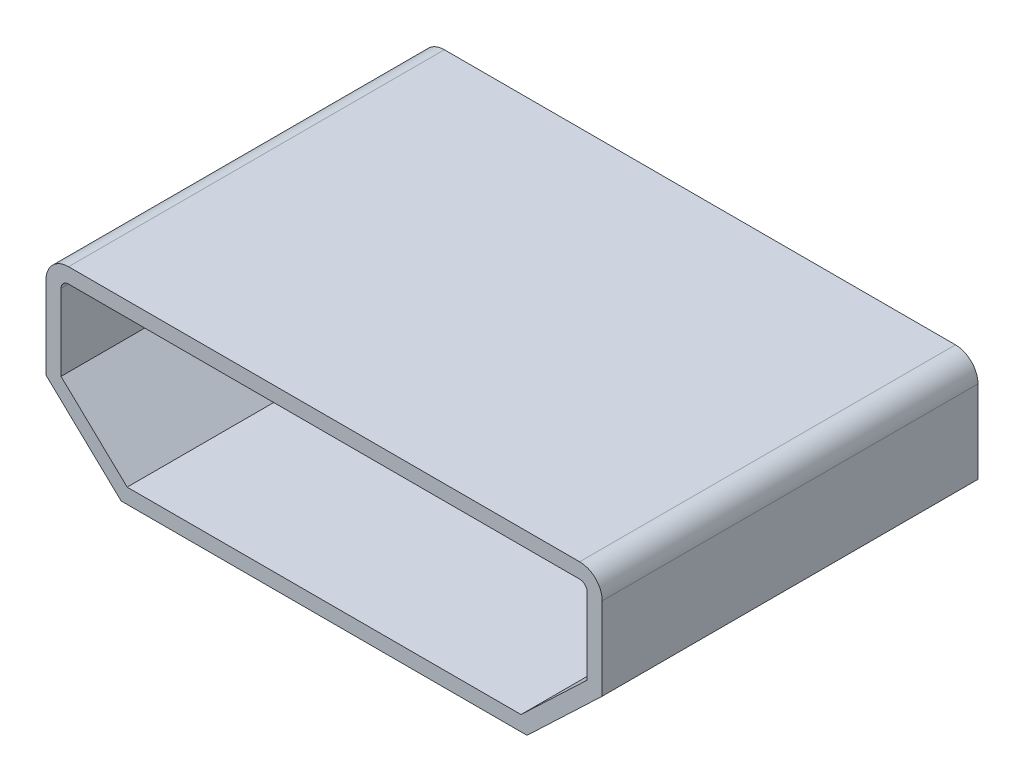
ISO-10303-21;
HEADER;
FILE_DESCRIPTION(('STEP AP214'),'2;1');
FILE_NAME('part.step','',(''),(''),'','','');
FILE_SCHEMA(('AUTOMOTIVE_DESIGN { 1 0 10303 214 1 1 1 1 }'));
ENDSEC;
DATA;
#1=APPLICATION_CONTEXT('core data for automotive mechanical design processes');
#2=APPLICATION_PROTOCOL_DEFINITION('international standard','automotive_design',2000,#1);
#3=PRODUCT_CONTEXT('',#1,'mechanical');
#4=PRODUCT('Part','Part','',(#3));
#5=PRODUCT_RELATED_PRODUCT_CATEGORY('part','',(#4));
#6=PRODUCT_DEFINITION_FORMATION('','',#4);
#7=PRODUCT_DEFINITION_CONTEXT('part definition',#1,'design');
#8=PRODUCT_DEFINITION('design','',#6,#7);
#9=PRODUCT_DEFINITION_SHAPE('','',#8);
#10=(LENGTH_UNIT() NAMED_UNIT(*) SI_UNIT(.MILLI.,.METRE.));
#11=(NAMED_UNIT(*) PLANE_ANGLE_UNIT() SI_UNIT($,.RADIAN.));
#12=(NAMED_UNIT(*) SI_UNIT($,.STERADIAN.) SOLID_ANGLE_UNIT());
#13=UNCERTAINTY_MEASURE_WITH_UNIT(LENGTH_MEASURE(1.E-05),#10,'distance_accuracy_value','');
#14=(GEOMETRIC_REPRESENTATION_CONTEXT(3) GLOBAL_UNCERTAINTY_ASSIGNED_CONTEXT((#13)) GLOBAL_UNIT_ASSIGNED_CONTEXT((#10,
#11,#12)) REPRESENTATION_CONTEXT('',''));
#15=CARTESIAN_POINT('',(0.,0.,0.));
#16=DIRECTION('',(0.,0.,1.));
#17=DIRECTION('',(1.,0.,0.));
#18=AXIS2_PLACEMENT_3D('',#15,#16,#17);
#19=CARTESIAN_POINT('',(3.5,2.05,-2.2));
#20=DIRECTION('',(1.,0.,0.));
#21=DIRECTION('',(0.,0.,-1.));
#22=AXIS2_PLACEMENT_3D('',#19,#20,#21);
#23=PLANE('',#22);
#24=DIRECTION('',(0.,0.,1.));
#25=VECTOR('',#24,1.);
#26=CARTESIAN_POINT('',(3.5,2.05,-2.2));
#27=LINE('',#26,#25);
#28=CARTESIAN_POINT('',(3.5,2.05,2.5));
#29=VERTEX_POINT('',#28);
#30=CARTESIAN_POINT('',(3.5,2.05,-2.2));
#31=VERTEX_POINT('',#30);
#32=EDGE_CURVE('E254',#29,#31,#27,.F.);
#33=ORIENTED_EDGE('',*,*,#32,.T.);
#34=DIRECTION('',(0.,1.,0.));
#35=VECTOR('',#34,1.);
#36=CARTESIAN_POINT('',(3.5,2.05,-2.2));
#37=LINE('',#36,#35);
#38=CARTESIAN_POINT('',(3.5,1.03586228448267,-2.2));
#39=VERTEX_POINT('',#38);
#40=EDGE_CURVE('E258',#39,#31,#37,.T.);
#41=ORIENTED_EDGE('',*,*,#40,.F.);
#42=DIRECTION('',(0.,0.,1.));
#43=VECTOR('',#42,1.);
#44=CARTESIAN_POINT('',(3.5,1.03586228448267,-2.2));
#45=LINE('',#44,#43);
#46=CARTESIAN_POINT('',(3.5,1.03586228448267,2.5));
#47=VERTEX_POINT('',#46);
#48=EDGE_CURVE('E266',#39,#47,#45,.T.);
#49=ORIENTED_EDGE('',*,*,#48,.T.);
#50=DIRECTION('',(0.,1.,0.));
#51=VECTOR('',#50,1.);
#52=CARTESIAN_POINT('',(3.5,2.05,2.5));
#53=LINE('',#52,#51);
#54=EDGE_CURVE('E242',#29,#47,#53,.F.);
#55=ORIENTED_EDGE('',*,*,#54,.F.);
#56=EDGE_LOOP('',(#33,#41,#49,#55));
#57=FACE_BOUND('',#56,.T.);
#58=ADVANCED_FACE('F17',(#57),#23,.F.);
#59=CARTESIAN_POINT('',(-3.5,2.05,-2.2));
#60=DIRECTION('',(-1.,0.,0.));
#61=DIRECTION('',(0.,0.,1.));
#62=AXIS2_PLACEMENT_3D('',#59,#60,#61);
#63=PLANE('',#62);
#64=DIRECTION('',(0.,0.,1.));
#65=VECTOR('',#64,1.);
#66=CARTESIAN_POINT('',(-3.5,1.03586228448267,-2.2));
#67=LINE('',#66,#65);
#68=CARTESIAN_POINT('',(-3.5,1.03586228448267,2.5));
#69=VERTEX_POINT('',#68);
#70=CARTESIAN_POINT('',(-3.5,1.03586228448267,-2.2));
#71=VERTEX_POINT('',#70);
#72=EDGE_CURVE('E219',#69,#71,#67,.F.);
#73=ORIENTED_EDGE('',*,*,#72,.T.);
#74=DIRECTION('',(0.,1.,0.));
#75=VECTOR('',#74,1.);
#76=CARTESIAN_POINT('',(-3.5,2.05,-2.2));
#77=LINE('',#76,#75);
#78=CARTESIAN_POINT('',(-3.5,2.05,-2.2));
#79=VERTEX_POINT('',#78);
#80=EDGE_CURVE('E206',#79,#71,#77,.F.);
#81=ORIENTED_EDGE('',*,*,#80,.F.);
#82=DIRECTION('',(0.,0.,1.));
#83=VECTOR('',#82,1.);
#84=CARTESIAN_POINT('',(-3.5,2.05,-2.2));
#85=LINE('',#84,#83);
#86=CARTESIAN_POINT('',(-3.5,2.05,2.5));
#87=VERTEX_POINT('',#86);
#88=EDGE_CURVE('E237',#79,#87,#85,.T.);
#89=ORIENTED_EDGE('',*,*,#88,.T.);
#90=DIRECTION('',(0.,1.,0.));
#91=VECTOR('',#90,1.);
#92=CARTESIAN_POINT('',(-3.5,2.05,2.5));
#93=LINE('',#92,#91);
#94=EDGE_CURVE('E215',#69,#87,#93,.T.);
#95=ORIENTED_EDGE('',*,*,#94,.F.);
#96=EDGE_LOOP('',(#73,#81,#89,#95));
#97=FACE_BOUND('',#96,.T.);
#98=ADVANCED_FACE('F311',(#97),#63,.F.);
#99=CARTESIAN_POINT('',(2.7,0.,-2.5));
#100=DIRECTION('',(-0.688749461914693,0.724999433594414,0.));
#101=DIRECTION('',(-0.724999433594414,-0.688749461914693,0.));
#102=AXIS2_PLACEMENT_3D('',#99,#100,#101);
#103=PLANE('',#102);
#104=DIRECTION('',(0.,0.,-1.));
#105=VECTOR('',#104,1.);
#106=CARTESIAN_POINT('',(2.7,0.,0.));
#107=LINE('',#106,#105);
#108=CARTESIAN_POINT('',(2.7,0.,-2.5));
#109=VERTEX_POINT('',#108);
#110=CARTESIAN_POINT('',(2.7,0.,2.5));
#111=VERTEX_POINT('',#110);
#112=EDGE_CURVE('E188',#109,#111,#107,.F.);
#113=ORIENTED_EDGE('',*,*,#112,.F.);
#114=DIRECTION('',(-0.724999433594414,-0.688749461914693,0.));
#115=VECTOR('',#114,1.);
#116=CARTESIAN_POINT('',(2.7,0.,-2.5));
#117=LINE('',#116,#115);
#118=CARTESIAN_POINT('',(3.7,0.95,-2.5));
#119=VERTEX_POINT('',#118);
#120=EDGE_CURVE('E212',#119,#109,#117,.T.);
#121=ORIENTED_EDGE('',*,*,#120,.F.);
#122=DIRECTION('',(0.,0.,1.));
#123=VECTOR('',#122,1.);
#124=CARTESIAN_POINT('',(3.7,0.95,2.5));
#125=LINE('',#124,#123);
#126=CARTESIAN_POINT('',(3.7,0.95,2.5));
#127=VERTEX_POINT('',#126);
#128=EDGE_CURVE('E189',#119,#127,#125,.T.);
#129=ORIENTED_EDGE('',*,*,#128,.T.);
#130=DIRECTION('',(-0.724999433594414,-0.688749461914693,0.));
#131=VECTOR('',#130,1.);
#132=CARTESIAN_POINT('',(2.7,0.,2.5));
#133=LINE('',#132,#131);
#134=EDGE_CURVE('E214',#111,#127,#133,.F.);
#135=ORIENTED_EDGE('',*,*,#134,.F.);
#136=EDGE_LOOP('',(#113,#121,#129,#135));
#137=FACE_BOUND('',#136,.T.);
#138=ADVANCED_FACE('F332',(#137),#103,.F.);
#139=CARTESIAN_POINT('',(-2.62014496370245,0.2,-2.2));
#140=DIRECTION('',(-0.688749461914693,-0.724999433594414,0.));
#141=DIRECTION('',(0.724999433594414,-0.688749461914693,0.));
#142=AXIS2_PLACEMENT_3D('',#139,#140,#141);
#143=PLANE('',#142);
#144=DIRECTION('',(0.,0.,-1.));
#145=VECTOR('',#144,1.);
#146=CARTESIAN_POINT('',(-2.62014496370245,0.2,-2.2));
#147=LINE('',#146,#145);
#148=CARTESIAN_POINT('',(-2.62014496370245,0.2,2.5));
#149=VERTEX_POINT('',#148);
#150=CARTESIAN_POINT('',(-2.62014496370245,0.2,-2.2));
#151=VERTEX_POINT('',#150);
#152=EDGE_CURVE('E175',#149,#151,#147,.T.);
#153=ORIENTED_EDGE('',*,*,#152,.T.);
#154=DIRECTION('',(0.724999433594415,-0.688749461914692,0.));
#155=VECTOR('',#154,1.);
#156=CARTESIAN_POINT('',(-3.5,1.03586228448267,-2.2));
#157=LINE('',#156,#155);
#158=EDGE_CURVE('E208',#71,#151,#157,.T.);
#159=ORIENTED_EDGE('',*,*,#158,.F.);
#160=ORIENTED_EDGE('',*,*,#72,.F.);
#161=DIRECTION('',(0.724999433594414,-0.688749461914693,0.));
#162=VECTOR('',#161,1.);
#163=CARTESIAN_POINT('',(-2.62014496370245,0.2,2.5));
#164=LINE('',#163,#162);
#165=EDGE_CURVE('E247',#149,#69,#164,.F.);
#166=ORIENTED_EDGE('',*,*,#165,.F.);
#167=EDGE_LOOP('',(#153,#159,#160,#166));
#168=FACE_BOUND('',#167,.T.);
#169=ADVANCED_FACE('F315',(#168),#143,.F.);
#170=CARTESIAN_POINT('',(3.5,1.03586228448267,-2.2));
#171=DIRECTION('',(0.688749461914693,-0.724999433594414,0.));
#172=DIRECTION('',(0.724999433594414,0.688749461914693,0.));
#173=AXIS2_PLACEMENT_3D('',#170,#171,#172);
#174=PLANE('',#173);
#175=ORIENTED_EDGE('',*,*,#48,.F.);
#176=DIRECTION('',(0.724999433594415,0.688749461914692,0.));
#177=VECTOR('',#176,1.);
#178=CARTESIAN_POINT('',(2.62014496370245,0.2,-2.2));
#179=LINE('',#178,#177);
#180=CARTESIAN_POINT('',(2.62014496370245,0.2,-2.2));
#181=VERTEX_POINT('',#180);
#182=EDGE_CURVE('E251',#181,#39,#179,.T.);
#183=ORIENTED_EDGE('',*,*,#182,.F.);
#184=DIRECTION('',(0.,0.,-1.));
#185=VECTOR('',#184,1.);
#186=CARTESIAN_POINT('',(2.62014496370245,0.2,-2.2));
#187=LINE('',#186,#185);
#188=CARTESIAN_POINT('',(2.62014496370245,0.199999999999999,2.5));
#189=VERTEX_POINT('',#188);
#190=EDGE_CURVE('E167',#181,#189,#187,.F.);
#191=ORIENTED_EDGE('',*,*,#190,.T.);
#192=DIRECTION('',(0.724999433594414,0.688749461914693,0.));
#193=VECTOR('',#192,1.);
#194=CARTESIAN_POINT('',(3.5,1.03586228448267,2.5));
#195=LINE('',#194,#193);
#196=EDGE_CURVE('E95',#47,#189,#195,.F.);
#197=ORIENTED_EDGE('',*,*,#196,.F.);
#198=EDGE_LOOP('',(#175,#183,#191,#197));
#199=FACE_BOUND('',#198,.T.);
#200=ADVANCED_FACE('F323',(#199),#174,.F.);
#201=CARTESIAN_POINT('',(3.4,2.05,-2.2));
#202=DIRECTION('',(0.,0.,1.));
#203=DIRECTION('',(1.,0.,0.));
#204=AXIS2_PLACEMENT_3D('',#201,#202,#203);
#205=CYLINDRICAL_SURFACE('',#204,0.0999999999999998);
#206=DIRECTION('',(0.,0.,1.));
#207=VECTOR('',#206,1.);
#208=CARTESIAN_POINT('',(3.4,2.15,-2.2));
#209=LINE('',#208,#207);
#210=CARTESIAN_POINT('',(3.4,2.15,2.5));
#211=VERTEX_POINT('',#210);
#212=CARTESIAN_POINT('',(3.4,2.15,-2.2));
#213=VERTEX_POINT('',#212);
#214=EDGE_CURVE('E164',#211,#213,#209,.F.);
#215=ORIENTED_EDGE('',*,*,#214,.T.);
#216=CARTESIAN_POINT('',(3.4,2.05,-2.2));
#217=DIRECTION('',(0.,0.,1.));
#218=DIRECTION('',(1.,0.,0.));
#219=AXIS2_PLACEMENT_3D('',#216,#217,#218);
#220=CIRCLE('',#219,0.0999999999999998);
#221=EDGE_CURVE('E209',#31,#213,#220,.T.);
#222=ORIENTED_EDGE('',*,*,#221,.F.);
#223=ORIENTED_EDGE('',*,*,#32,.F.);
#224=CARTESIAN_POINT('',(3.4,2.05,2.5));
#225=DIRECTION('',(0.,0.,1.));
#226=DIRECTION('',(1.,0.,0.));
#227=AXIS2_PLACEMENT_3D('',#224,#225,#226);
#228=CIRCLE('',#227,0.0999999999999998);
#229=EDGE_CURVE('E20',#211,#29,#228,.F.);
#230=ORIENTED_EDGE('',*,*,#229,.F.);
#231=EDGE_LOOP('',(#215,#222,#223,#230));
#232=FACE_BOUND('',#231,.T.);
#233=ADVANCED_FACE('F301',(#232),#205,.F.);
#234=CARTESIAN_POINT('',(3.4,2.05,-2.2));
#235=DIRECTION('',(0.,0.,1.));
#236=DIRECTION('',(1.,0.,0.));
#237=AXIS2_PLACEMENT_3D('',#234,#235,#236);
#238=PLANE('',#237);
#239=ORIENTED_EDGE('',*,*,#182,.T.);
#240=ORIENTED_EDGE('',*,*,#40,.T.);
#241=ORIENTED_EDGE('',*,*,#221,.T.);
#242=DIRECTION('',(1.,0.,0.));
#243=VECTOR('',#242,1.);
#244=CARTESIAN_POINT('',(-3.4,2.15,-2.2));
#245=LINE('',#244,#243);
#246=CARTESIAN_POINT('',(-3.4,2.15,-2.2));
#247=VERTEX_POINT('',#246);
#248=EDGE_CURVE('E166',#213,#247,#245,.F.);
#249=ORIENTED_EDGE('',*,*,#248,.T.);
#250=CARTESIAN_POINT('',(-3.4,2.05,-2.2));
#251=DIRECTION('',(0.,0.,1.));
#252=DIRECTION('',(1.,0.,0.));
#253=AXIS2_PLACEMENT_3D('',#250,#251,#252);
#254=CIRCLE('',#253,0.0999999999999998);
#255=EDGE_CURVE('E240',#247,#79,#254,.T.);
#256=ORIENTED_EDGE('',*,*,#255,.T.);
#257=ORIENTED_EDGE('',*,*,#80,.T.);
#258=ORIENTED_EDGE('',*,*,#158,.T.);
#259=DIRECTION('',(1.,0.,0.));
#260=VECTOR('',#259,1.);
#261=CARTESIAN_POINT('',(-2.62014496370245,0.2,-2.2));
#262=LINE('',#261,#260);
#263=EDGE_CURVE('E172',#151,#181,#262,.T.);
#264=ORIENTED_EDGE('',*,*,#263,.T.);
#265=EDGE_LOOP('',(#239,#240,#241,#249,#256,#257,#258,#264));
#266=FACE_BOUND('',#265,.T.);
#267=ADVANCED_FACE('F305',(#266),#238,.T.);
#268=CARTESIAN_POINT('',(-3.4,2.05,-2.2));
#269=DIRECTION('',(0.,0.,1.));
#270=DIRECTION('',(1.,0.,0.));
#271=AXIS2_PLACEMENT_3D('',#268,#269,#270);
#272=CYLINDRICAL_SURFACE('',#271,0.0999999999999998);
#273=ORIENTED_EDGE('',*,*,#88,.F.);
#274=ORIENTED_EDGE('',*,*,#255,.F.);
#275=DIRECTION('',(0.,0.,1.));
#276=VECTOR('',#275,1.);
#277=CARTESIAN_POINT('',(-3.4,2.15,-2.2));
#278=LINE('',#277,#276);
#279=CARTESIAN_POINT('',(-3.4,2.15,2.5));
#280=VERTEX_POINT('',#279);
#281=EDGE_CURVE('E168',#247,#280,#278,.T.);
#282=ORIENTED_EDGE('',*,*,#281,.T.);
#283=CARTESIAN_POINT('',(-3.4,2.05,2.5));
#284=DIRECTION('',(0.,0.,1.));
#285=DIRECTION('',(1.,0.,0.));
#286=AXIS2_PLACEMENT_3D('',#283,#284,#285);
#287=CIRCLE('',#286,0.0999999999999998);
#288=EDGE_CURVE('E201',#87,#280,#287,.F.);
#289=ORIENTED_EDGE('',*,*,#288,.F.);
#290=EDGE_LOOP('',(#273,#274,#282,#289));
#291=FACE_BOUND('',#290,.T.);
#292=ADVANCED_FACE('F308',(#291),#272,.F.);
#293=CARTESIAN_POINT('',(-2.7,0.,-2.5));
#294=DIRECTION('',(0.688749461914693,0.724999433594414,0.));
#295=DIRECTION('',(-0.724999433594414,0.688749461914693,0.));
#296=AXIS2_PLACEMENT_3D('',#293,#294,#295);
#297=PLANE('',#296);
#298=DIRECTION('',(0.,0.,-1.));
#299=VECTOR('',#298,1.);
#300=CARTESIAN_POINT('',(-3.7,0.95,2.5));
#301=LINE('',#300,#299);
#302=CARTESIAN_POINT('',(-3.7,0.95,2.5));
#303=VERTEX_POINT('',#302);
#304=CARTESIAN_POINT('',(-3.7,0.95,-2.5));
#305=VERTEX_POINT('',#304);
#306=EDGE_CURVE('E149',#303,#305,#301,.T.);
#307=ORIENTED_EDGE('',*,*,#306,.T.);
#308=DIRECTION('',(-0.724999433594414,0.688749461914693,0.));
#309=VECTOR('',#308,1.);
#310=CARTESIAN_POINT('',(-2.7,0.,-2.5));
#311=LINE('',#310,#309);
#312=CARTESIAN_POINT('',(-2.7,0.,-2.5));
#313=VERTEX_POINT('',#312);
#314=EDGE_CURVE('E143',#313,#305,#311,.T.);
#315=ORIENTED_EDGE('',*,*,#314,.F.);
#316=DIRECTION('',(0.,0.,-1.));
#317=VECTOR('',#316,1.);
#318=CARTESIAN_POINT('',(-2.7,0.,0.));
#319=LINE('',#318,#317);
#320=CARTESIAN_POINT('',(-2.7,0.,2.5));
#321=VERTEX_POINT('',#320);
#322=EDGE_CURVE('E178',#321,#313,#319,.T.);
#323=ORIENTED_EDGE('',*,*,#322,.F.);
#324=DIRECTION('',(-0.724999433594414,0.688749461914693,0.));
#325=VECTOR('',#324,1.);
#326=CARTESIAN_POINT('',(-2.7,0.,2.5));
#327=LINE('',#326,#325);
#328=EDGE_CURVE('E194',#303,#321,#327,.F.);
#329=ORIENTED_EDGE('',*,*,#328,.F.);
#330=EDGE_LOOP('',(#307,#315,#323,#329));
#331=FACE_BOUND('',#330,.T.);
#332=ADVANCED_FACE('F365',(#331),#297,.F.);
#333=CARTESIAN_POINT('',(3.7,2.35,2.5));
#334=DIRECTION('',(-1.,0.,0.));
#335=DIRECTION('',(0.,0.,1.));
#336=AXIS2_PLACEMENT_3D('',#333,#334,#335);
#337=PLANE('',#336);
#338=ORIENTED_EDGE('',*,*,#128,.F.);
#339=DIRECTION('',(0.,1.,0.));
#340=VECTOR('',#339,1.);
#341=CARTESIAN_POINT('',(3.7,2.35,-2.5));
#342=LINE('',#341,#340);
#343=CARTESIAN_POINT('',(3.7,2.05,-2.5));
#344=VERTEX_POINT('',#343);
#345=EDGE_CURVE('E182',#119,#344,#342,.T.);
#346=ORIENTED_EDGE('',*,*,#345,.T.);
#347=DIRECTION('',(0.,0.,1.));
#348=VECTOR('',#347,1.);
#349=CARTESIAN_POINT('',(3.7,2.05,-2.5));
#350=LINE('',#349,#348);
#351=CARTESIAN_POINT('',(3.7,2.05,2.5));
#352=VERTEX_POINT('',#351);
#353=EDGE_CURVE('E179',#352,#344,#350,.F.);
#354=ORIENTED_EDGE('',*,*,#353,.F.);
#355=DIRECTION('',(0.,1.,0.));
#356=VECTOR('',#355,1.);
#357=CARTESIAN_POINT('',(3.7,2.35,2.5));
#358=LINE('',#357,#356);
#359=EDGE_CURVE('E186',#127,#352,#358,.T.);
#360=ORIENTED_EDGE('',*,*,#359,.F.);
#361=EDGE_LOOP('',(#338,#346,#354,#360));
#362=FACE_BOUND('',#361,.T.);
#363=ADVANCED_FACE('F361',(#362),#337,.F.);
#364=CARTESIAN_POINT('',(0.,0.,0.));
#365=DIRECTION('',(0.,-1.,0.));
#366=DIRECTION('',(0.,0.,-1.));
#367=AXIS2_PLACEMENT_3D('',#364,#365,#366);
#368=PLANE('',#367);
#369=ORIENTED_EDGE('',*,*,#322,.T.);
#370=DIRECTION('',(1.,0.,0.));
#371=VECTOR('',#370,1.);
#372=CARTESIAN_POINT('',(-3.7,0.,-2.5));
#373=LINE('',#372,#371);
#374=EDGE_CURVE('E148',#313,#109,#373,.T.);
#375=ORIENTED_EDGE('',*,*,#374,.T.);
#376=ORIENTED_EDGE('',*,*,#112,.T.);
#377=DIRECTION('',(-1.,0.,0.));
#378=VECTOR('',#377,1.);
#379=CARTESIAN_POINT('',(-3.7,0.,2.5));
#380=LINE('',#379,#378);
#381=EDGE_CURVE('E226',#111,#321,#380,.T.);
#382=ORIENTED_EDGE('',*,*,#381,.T.);
#383=EDGE_LOOP('',(#369,#375,#376,#382));
#384=FACE_BOUND('',#383,.T.);
#385=ADVANCED_FACE('F358',(#384),#368,.T.);
#386=CARTESIAN_POINT('',(-2.62014496370245,0.2,-2.2));
#387=DIRECTION('',(0.,-1.,0.));
#388=DIRECTION('',(0.,0.,-1.));
#389=AXIS2_PLACEMENT_3D('',#386,#387,#388);
#390=PLANE('',#389);
#391=ORIENTED_EDGE('',*,*,#190,.F.);
#392=ORIENTED_EDGE('',*,*,#263,.F.);
#393=ORIENTED_EDGE('',*,*,#152,.F.);
#394=DIRECTION('',(-1.,0.,0.));
#395=VECTOR('',#394,1.);
#396=CARTESIAN_POINT('',(-3.7,0.2,2.5));
#397=LINE('',#396,#395);
#398=EDGE_CURVE('E229',#149,#189,#397,.F.);
#399=ORIENTED_EDGE('',*,*,#398,.T.);
#400=EDGE_LOOP('',(#391,#392,#393,#399));
#401=FACE_BOUND('',#400,.T.);
#402=ADVANCED_FACE('F320',(#401),#390,.F.);
#403=CARTESIAN_POINT('',(-3.4,2.15,-2.2));
#404=DIRECTION('',(0.,1.,0.));
#405=DIRECTION('',(0.,0.,1.));
#406=AXIS2_PLACEMENT_3D('',#403,#404,#405);
#407=PLANE('',#406);
#408=ORIENTED_EDGE('',*,*,#281,.F.);
#409=ORIENTED_EDGE('',*,*,#248,.F.);
#410=ORIENTED_EDGE('',*,*,#214,.F.);
#411=DIRECTION('',(-1.,0.,0.));
#412=VECTOR('',#411,1.);
#413=CARTESIAN_POINT('',(-3.7,2.15,2.5));
#414=LINE('',#413,#412);
#415=EDGE_CURVE('E285',#211,#280,#414,.T.);
#416=ORIENTED_EDGE('',*,*,#415,.T.);
#417=EDGE_LOOP('',(#408,#409,#410,#416));
#418=FACE_BOUND('',#417,.T.);
#419=ADVANCED_FACE('F304',(#418),#407,.F.);
#420=CARTESIAN_POINT('',(-3.7,2.35,2.5));
#421=DIRECTION('',(1.,0.,0.));
#422=DIRECTION('',(0.,0.,-1.));
#423=AXIS2_PLACEMENT_3D('',#420,#421,#422);
#424=PLANE('',#423);
#425=DIRECTION('',(0.,0.,1.));
#426=VECTOR('',#425,1.);
#427=CARTESIAN_POINT('',(-3.7,2.05,-2.5));
#428=LINE('',#427,#426);
#429=CARTESIAN_POINT('',(-3.7,2.05,-2.5));
#430=VERTEX_POINT('',#429);
#431=CARTESIAN_POINT('',(-3.7,2.05,2.5));
#432=VERTEX_POINT('',#431);
#433=EDGE_CURVE('E152',#430,#432,#428,.T.);
#434=ORIENTED_EDGE('',*,*,#433,.F.);
#435=DIRECTION('',(0.,1.,0.));
#436=VECTOR('',#435,1.);
#437=CARTESIAN_POINT('',(-3.7,2.35,-2.5));
#438=LINE('',#437,#436);
#439=EDGE_CURVE('E137',#430,#305,#438,.F.);
#440=ORIENTED_EDGE('',*,*,#439,.T.);
#441=ORIENTED_EDGE('',*,*,#306,.F.);
#442=DIRECTION('',(0.,1.,0.));
#443=VECTOR('',#442,1.);
#444=CARTESIAN_POINT('',(-3.7,2.35,2.5));
#445=LINE('',#444,#443);
#446=EDGE_CURVE('E156',#303,#432,#445,.T.);
#447=ORIENTED_EDGE('',*,*,#446,.T.);
#448=EDGE_LOOP('',(#434,#440,#441,#447));
#449=FACE_BOUND('',#448,.T.);
#450=ADVANCED_FACE('F154',(#449),#424,.F.);
#451=CARTESIAN_POINT('',(-3.7,2.35,-2.5));
#452=DIRECTION('',(0.,0.,1.));
#453=DIRECTION('',(1.,0.,0.));
#454=AXIS2_PLACEMENT_3D('',#451,#452,#453);
#455=PLANE('',#454);
#456=ORIENTED_EDGE('',*,*,#120,.T.);
#457=ORIENTED_EDGE('',*,*,#374,.F.);
#458=ORIENTED_EDGE('',*,*,#314,.T.);
#459=ORIENTED_EDGE('',*,*,#439,.F.);
#460=CARTESIAN_POINT('',(-3.4,2.05,-2.5));
#461=DIRECTION('',(0.,0.,1.));
#462=DIRECTION('',(1.,0.,0.));
#463=AXIS2_PLACEMENT_3D('',#460,#461,#462);
#464=CIRCLE('',#463,0.3);
#465=CARTESIAN_POINT('',(-3.4,2.35,-2.5));
#466=VERTEX_POINT('',#465);
#467=EDGE_CURVE('E141',#466,#430,#464,.T.);
#468=ORIENTED_EDGE('',*,*,#467,.F.);
#469=DIRECTION('',(1.,0.,0.));
#470=VECTOR('',#469,1.);
#471=CARTESIAN_POINT('',(0.,2.35,-2.5));
#472=LINE('',#471,#470);
#473=CARTESIAN_POINT('',(3.4,2.35,-2.5));
#474=VERTEX_POINT('',#473);
#475=EDGE_CURVE('E157',#466,#474,#472,.T.);
#476=ORIENTED_EDGE('',*,*,#475,.T.);
#477=CARTESIAN_POINT('',(3.4,2.05,-2.5));
#478=DIRECTION('',(0.,0.,1.));
#479=DIRECTION('',(1.,0.,0.));
#480=AXIS2_PLACEMENT_3D('',#477,#478,#479);
#481=CIRCLE('',#480,0.3);
#482=EDGE_CURVE('E181',#344,#474,#481,.T.);
#483=ORIENTED_EDGE('',*,*,#482,.F.);
#484=ORIENTED_EDGE('',*,*,#345,.F.);
#485=EDGE_LOOP('',(#456,#457,#458,#459,#468,#476,#483,#484));
#486=FACE_BOUND('',#485,.T.);
#487=ADVANCED_FACE('F139',(#486),#455,.F.);
#488=CARTESIAN_POINT('',(3.4,2.05,-2.5));
#489=DIRECTION('',(0.,0.,1.));
#490=DIRECTION('',(1.,0.,0.));
#491=AXIS2_PLACEMENT_3D('',#488,#489,#490);
#492=CYLINDRICAL_SURFACE('',#491,0.3);
#493=ORIENTED_EDGE('',*,*,#482,.T.);
#494=DIRECTION('',(0.,0.,-1.));
#495=VECTOR('',#494,1.);
#496=CARTESIAN_POINT('',(3.4,2.35,0.));
#497=LINE('',#496,#495);
#498=CARTESIAN_POINT('',(3.4,2.35,2.5));
#499=VERTEX_POINT('',#498);
#500=EDGE_CURVE('E159',#474,#499,#497,.F.);
#501=ORIENTED_EDGE('',*,*,#500,.T.);
#502=CARTESIAN_POINT('',(3.4,2.05,2.5));
#503=DIRECTION('',(0.,0.,1.));
#504=DIRECTION('',(1.,0.,0.));
#505=AXIS2_PLACEMENT_3D('',#502,#503,#504);
#506=CIRCLE('',#505,0.3);
#507=EDGE_CURVE('E230',#499,#352,#506,.F.);
#508=ORIENTED_EDGE('',*,*,#507,.T.);
#509=ORIENTED_EDGE('',*,*,#353,.T.);
#510=EDGE_LOOP('',(#493,#501,#508,#509));
#511=FACE_BOUND('',#510,.T.);
#512=ADVANCED_FACE('F346',(#511),#492,.T.);
#513=CARTESIAN_POINT('',(-3.7,2.35,2.5));
#514=DIRECTION('',(0.,0.,-1.));
#515=DIRECTION('',(-1.,0.,0.));
#516=AXIS2_PLACEMENT_3D('',#513,#514,#515);
#517=PLANE('',#516);
#518=ORIENTED_EDGE('',*,*,#229,.T.);
#519=ORIENTED_EDGE('',*,*,#54,.T.);
#520=ORIENTED_EDGE('',*,*,#196,.T.);
#521=ORIENTED_EDGE('',*,*,#398,.F.);
#522=ORIENTED_EDGE('',*,*,#165,.T.);
#523=ORIENTED_EDGE('',*,*,#94,.T.);
#524=ORIENTED_EDGE('',*,*,#288,.T.);
#525=ORIENTED_EDGE('',*,*,#415,.F.);
#526=EDGE_LOOP('',(#518,#519,#520,#521,#522,#523,#524,#525));
#527=FACE_BOUND('',#526,.T.);
#528=ORIENTED_EDGE('',*,*,#134,.T.);
#529=ORIENTED_EDGE('',*,*,#359,.T.);
#530=ORIENTED_EDGE('',*,*,#507,.F.);
#531=DIRECTION('',(1.,0.,0.));
#532=VECTOR('',#531,1.);
#533=CARTESIAN_POINT('',(0.,2.35,2.5));
#534=LINE('',#533,#532);
#535=CARTESIAN_POINT('',(-3.4,2.35,2.5));
#536=VERTEX_POINT('',#535);
#537=EDGE_CURVE('E26',#499,#536,#534,.F.);
#538=ORIENTED_EDGE('',*,*,#537,.T.);
#539=CARTESIAN_POINT('',(-3.4,2.05,2.5));
#540=DIRECTION('',(0.,0.,1.));
#541=DIRECTION('',(1.,0.,0.));
#542=AXIS2_PLACEMENT_3D('',#539,#540,#541);
#543=CIRCLE('',#542,0.3);
#544=EDGE_CURVE('E34',#432,#536,#543,.F.);
#545=ORIENTED_EDGE('',*,*,#544,.F.);
#546=ORIENTED_EDGE('',*,*,#446,.F.);
#547=ORIENTED_EDGE('',*,*,#328,.T.);
#548=ORIENTED_EDGE('',*,*,#381,.F.);
#549=EDGE_LOOP('',(#528,#529,#530,#538,#545,#546,#547,#548));
#550=FACE_BOUND('',#549,.T.);
#551=ADVANCED_FACE('F295',(#527,#550),#517,.F.);
#552=CARTESIAN_POINT('',(-3.4,2.05,-2.5));
#553=DIRECTION('',(0.,0.,1.));
#554=DIRECTION('',(1.,0.,0.));
#555=AXIS2_PLACEMENT_3D('',#552,#553,#554);
#556=CYLINDRICAL_SURFACE('',#555,0.3);
#557=ORIENTED_EDGE('',*,*,#467,.T.);
#558=ORIENTED_EDGE('',*,*,#433,.T.);
#559=ORIENTED_EDGE('',*,*,#544,.T.);
#560=DIRECTION('',(0.,0.,-1.));
#561=VECTOR('',#560,1.);
#562=CARTESIAN_POINT('',(-3.4,2.35,0.));
#563=LINE('',#562,#561);
#564=EDGE_CURVE('E11',#536,#466,#563,.T.);
#565=ORIENTED_EDGE('',*,*,#564,.T.);
#566=EDGE_LOOP('',(#557,#558,#559,#565));
#567=FACE_BOUND('',#566,.T.);
#568=ADVANCED_FACE('F151',(#567),#556,.T.);
#569=CARTESIAN_POINT('',(0.,2.35,0.));
#570=DIRECTION('',(0.,-1.,0.));
#571=DIRECTION('',(0.,0.,-1.));
#572=AXIS2_PLACEMENT_3D('',#569,#570,#571);
#573=PLANE('',#572);
#574=ORIENTED_EDGE('',*,*,#537,.F.);
#575=ORIENTED_EDGE('',*,*,#500,.F.);
#576=ORIENTED_EDGE('',*,*,#475,.F.);
#577=ORIENTED_EDGE('',*,*,#564,.F.);
#578=EDGE_LOOP('',(#574,#575,#576,#577));
#579=FACE_BOUND('',#578,.T.);
#580=ADVANCED_FACE('F334',(#579),#573,.F.);
#581=CLOSED_SHELL('',(#58,#98,#138,#169,#200,#233,#267,#292,#332,#363,#385,#402,#419,#450,#487,
#512,#551,#568,#580));
#582=MANIFOLD_SOLID_BREP('B1',#581);
#583=ADVANCED_BREP_SHAPE_REPRESENTATION('',(#18,#582),#14);
#584=SHAPE_DEFINITION_REPRESENTATION(#9,#583);
ENDSEC;
END-ISO-10303-21;
